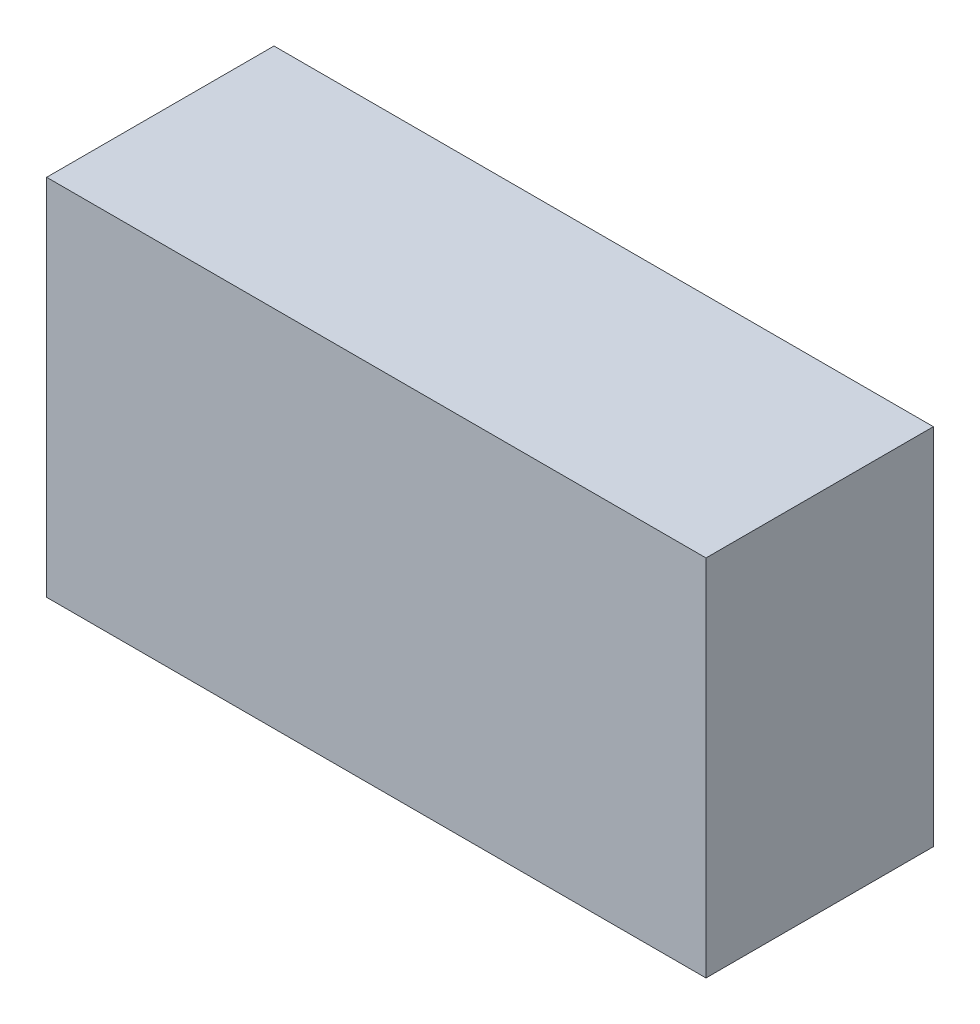
ISO-10303-21;
HEADER;
FILE_DESCRIPTION(('STEP AP214'),'2;1');
FILE_NAME('part.step','',(''),(''),'','','');
FILE_SCHEMA(('AUTOMOTIVE_DESIGN { 1 0 10303 214 1 1 1 1 }'));
ENDSEC;
DATA;
#1=APPLICATION_CONTEXT('core data for automotive mechanical design processes');
#2=APPLICATION_PROTOCOL_DEFINITION('international standard','automotive_design',2000,#1);
#3=PRODUCT_CONTEXT('',#1,'mechanical');
#4=PRODUCT('Part','Part','',(#3));
#5=PRODUCT_RELATED_PRODUCT_CATEGORY('part','',(#4));
#6=PRODUCT_DEFINITION_FORMATION('','',#4);
#7=PRODUCT_DEFINITION_CONTEXT('part definition',#1,'design');
#8=PRODUCT_DEFINITION('design','',#6,#7);
#9=PRODUCT_DEFINITION_SHAPE('','',#8);
#10=(LENGTH_UNIT() NAMED_UNIT(*) SI_UNIT(.MILLI.,.METRE.));
#11=(NAMED_UNIT(*) PLANE_ANGLE_UNIT() SI_UNIT($,.RADIAN.));
#12=(NAMED_UNIT(*) SI_UNIT($,.STERADIAN.) SOLID_ANGLE_UNIT());
#13=UNCERTAINTY_MEASURE_WITH_UNIT(LENGTH_MEASURE(1.E-05),#10,'distance_accuracy_value','');
#14=(GEOMETRIC_REPRESENTATION_CONTEXT(3) GLOBAL_UNCERTAINTY_ASSIGNED_CONTEXT((#13)) GLOBAL_UNIT_ASSIGNED_CONTEXT((#10,
#11,#12)) REPRESENTATION_CONTEXT('',''));
#15=CARTESIAN_POINT('',(0.,0.,0.));
#16=DIRECTION('',(0.,0.,1.));
#17=DIRECTION('',(1.,0.,0.));
#18=AXIS2_PLACEMENT_3D('',#15,#16,#17);
#19=CARTESIAN_POINT('',(1.44999964,0.80000094,0.));
#20=DIRECTION('',(0.,-1.,0.));
#21=DIRECTION('',(-1.,0.,0.));
#22=AXIS2_PLACEMENT_3D('',#19,#20,#21);
#23=PLANE('',#22);
#24=DIRECTION('',(-1.,0.,0.));
#25=VECTOR('',#24,1.);
#26=CARTESIAN_POINT('',(1.44999964,0.80000094,0.));
#27=LINE('',#26,#25);
#28=CARTESIAN_POINT('',(1.44999964,0.80000094,0.));
#29=VERTEX_POINT('',#28);
#30=CARTESIAN_POINT('',(-1.44999964,0.80000094,0.));
#31=VERTEX_POINT('',#30);
#32=EDGE_CURVE('E11',#29,#31,#27,.T.);
#33=ORIENTED_EDGE('',*,*,#32,.T.);
#34=DIRECTION('',(0.,0.,1.));
#35=VECTOR('',#34,1.);
#36=CARTESIAN_POINT('',(-1.44999964,0.80000094,0.));
#37=LINE('',#36,#35);
#38=CARTESIAN_POINT('',(-1.44999964,0.80000094,1.00000054));
#39=VERTEX_POINT('',#38);
#40=EDGE_CURVE('E23',#31,#39,#37,.T.);
#41=ORIENTED_EDGE('',*,*,#40,.T.);
#42=DIRECTION('',(-1.,0.,0.));
#43=VECTOR('',#42,1.);
#44=CARTESIAN_POINT('',(1.44999964,0.80000094,1.00000054));
#45=LINE('',#44,#43);
#46=CARTESIAN_POINT('',(1.44999964,0.80000094,1.00000054));
#47=VERTEX_POINT('',#46);
#48=EDGE_CURVE('E86',#47,#39,#45,.T.);
#49=ORIENTED_EDGE('',*,*,#48,.F.);
#50=DIRECTION('',(0.,0.,1.));
#51=VECTOR('',#50,1.);
#52=CARTESIAN_POINT('',(1.44999964,0.80000094,0.));
#53=LINE('',#52,#51);
#54=EDGE_CURVE('E35',#29,#47,#53,.T.);
#55=ORIENTED_EDGE('',*,*,#54,.F.);
#56=EDGE_LOOP('',(#33,#41,#49,#55));
#57=FACE_BOUND('',#56,.T.);
#58=ADVANCED_FACE('F16',(#57),#23,.F.);
#59=CARTESIAN_POINT('',(-1.44999964,0.80000094,0.));
#60=DIRECTION('',(1.,0.,0.));
#61=DIRECTION('',(0.,-1.,0.));
#62=AXIS2_PLACEMENT_3D('',#59,#60,#61);
#63=PLANE('',#62);
#64=DIRECTION('',(0.,-1.,0.));
#65=VECTOR('',#64,1.);
#66=CARTESIAN_POINT('',(-1.44999964,0.80000094,0.));
#67=LINE('',#66,#65);
#68=CARTESIAN_POINT('',(-1.44999964,-0.7999984,0.));
#69=VERTEX_POINT('',#68);
#70=EDGE_CURVE('E83',#31,#69,#67,.T.);
#71=ORIENTED_EDGE('',*,*,#70,.T.);
#72=DIRECTION('',(0.,0.,1.));
#73=VECTOR('',#72,1.);
#74=CARTESIAN_POINT('',(-1.44999964,-0.7999984,0.));
#75=LINE('',#74,#73);
#76=CARTESIAN_POINT('',(-1.44999964,-0.7999984,1.00000054));
#77=VERTEX_POINT('',#76);
#78=EDGE_CURVE('E81',#69,#77,#75,.T.);
#79=ORIENTED_EDGE('',*,*,#78,.T.);
#80=DIRECTION('',(0.,-1.,0.));
#81=VECTOR('',#80,1.);
#82=CARTESIAN_POINT('',(-1.44999964,0.80000094,1.00000054));
#83=LINE('',#82,#81);
#84=EDGE_CURVE('E61',#39,#77,#83,.T.);
#85=ORIENTED_EDGE('',*,*,#84,.F.);
#86=ORIENTED_EDGE('',*,*,#40,.F.);
#87=EDGE_LOOP('',(#71,#79,#85,#86));
#88=FACE_BOUND('',#87,.T.);
#89=ADVANCED_FACE('F88',(#88),#63,.F.);
#90=CARTESIAN_POINT('',(-1.44999964,-0.7999984,0.));
#91=DIRECTION('',(0.,1.,0.));
#92=DIRECTION('',(1.,0.,0.));
#93=AXIS2_PLACEMENT_3D('',#90,#91,#92);
#94=PLANE('',#93);
#95=DIRECTION('',(1.,0.,0.));
#96=VECTOR('',#95,1.);
#97=CARTESIAN_POINT('',(-1.44999964,-0.7999984,0.));
#98=LINE('',#97,#96);
#99=CARTESIAN_POINT('',(1.44999964,-0.7999984,0.));
#100=VERTEX_POINT('',#99);
#101=EDGE_CURVE('E70',#69,#100,#98,.T.);
#102=ORIENTED_EDGE('',*,*,#101,.T.);
#103=DIRECTION('',(0.,0.,1.));
#104=VECTOR('',#103,1.);
#105=CARTESIAN_POINT('',(1.44999964,-0.7999984,0.));
#106=LINE('',#105,#104);
#107=CARTESIAN_POINT('',(1.44999964,-0.7999984,1.00000054));
#108=VERTEX_POINT('',#107);
#109=EDGE_CURVE('E64',#100,#108,#106,.T.);
#110=ORIENTED_EDGE('',*,*,#109,.T.);
#111=DIRECTION('',(1.,0.,0.));
#112=VECTOR('',#111,1.);
#113=CARTESIAN_POINT('',(-1.44999964,-0.7999984,1.00000054));
#114=LINE('',#113,#112);
#115=EDGE_CURVE('E56',#77,#108,#114,.T.);
#116=ORIENTED_EDGE('',*,*,#115,.F.);
#117=ORIENTED_EDGE('',*,*,#78,.F.);
#118=EDGE_LOOP('',(#102,#110,#116,#117));
#119=FACE_BOUND('',#118,.T.);
#120=ADVANCED_FACE('F68',(#119),#94,.F.);
#121=CARTESIAN_POINT('',(1.44999964,-0.7999984,0.));
#122=DIRECTION('',(-1.,0.,0.));
#123=DIRECTION('',(0.,1.,0.));
#124=AXIS2_PLACEMENT_3D('',#121,#122,#123);
#125=PLANE('',#124);
#126=DIRECTION('',(0.,1.,0.));
#127=VECTOR('',#126,1.);
#128=CARTESIAN_POINT('',(1.44999964,-0.7999984,0.));
#129=LINE('',#128,#127);
#130=EDGE_CURVE('E65',#100,#29,#129,.T.);
#131=ORIENTED_EDGE('',*,*,#130,.T.);
#132=ORIENTED_EDGE('',*,*,#54,.T.);
#133=DIRECTION('',(0.,1.,0.));
#134=VECTOR('',#133,1.);
#135=CARTESIAN_POINT('',(1.44999964,-0.7999984,1.00000054));
#136=LINE('',#135,#134);
#137=EDGE_CURVE('E60',#108,#47,#136,.T.);
#138=ORIENTED_EDGE('',*,*,#137,.F.);
#139=ORIENTED_EDGE('',*,*,#109,.F.);
#140=EDGE_LOOP('',(#131,#132,#138,#139));
#141=FACE_BOUND('',#140,.T.);
#142=ADVANCED_FACE('F75',(#141),#125,.F.);
#143=CARTESIAN_POINT('',(1.44999964,0.80000094,0.));
#144=DIRECTION('',(0.,0.,-1.));
#145=DIRECTION('',(-1.,0.,0.));
#146=AXIS2_PLACEMENT_3D('',#143,#144,#145);
#147=PLANE('',#146);
#148=ORIENTED_EDGE('',*,*,#130,.F.);
#149=ORIENTED_EDGE('',*,*,#101,.F.);
#150=ORIENTED_EDGE('',*,*,#70,.F.);
#151=ORIENTED_EDGE('',*,*,#32,.F.);
#152=EDGE_LOOP('',(#148,#149,#150,#151));
#153=FACE_BOUND('',#152,.T.);
#154=ADVANCED_FACE('F90',(#153),#147,.T.);
#155=CARTESIAN_POINT('',(1.44999964,0.80000094,1.00000054));
#156=DIRECTION('',(0.,0.,-1.));
#157=DIRECTION('',(-1.,0.,0.));
#158=AXIS2_PLACEMENT_3D('',#155,#156,#157);
#159=PLANE('',#158);
#160=ORIENTED_EDGE('',*,*,#48,.T.);
#161=ORIENTED_EDGE('',*,*,#84,.T.);
#162=ORIENTED_EDGE('',*,*,#115,.T.);
#163=ORIENTED_EDGE('',*,*,#137,.T.);
#164=EDGE_LOOP('',(#160,#161,#162,#163));
#165=FACE_BOUND('',#164,.T.);
#166=ADVANCED_FACE('F58',(#165),#159,.F.);
#167=CLOSED_SHELL('',(#58,#89,#120,#142,#154,#166));
#168=MANIFOLD_SOLID_BREP('B1',#167);
#169=ADVANCED_BREP_SHAPE_REPRESENTATION('',(#18,#168),#14);
#170=SHAPE_DEFINITION_REPRESENTATION(#9,#169);
ENDSEC;
END-ISO-10303-21;
